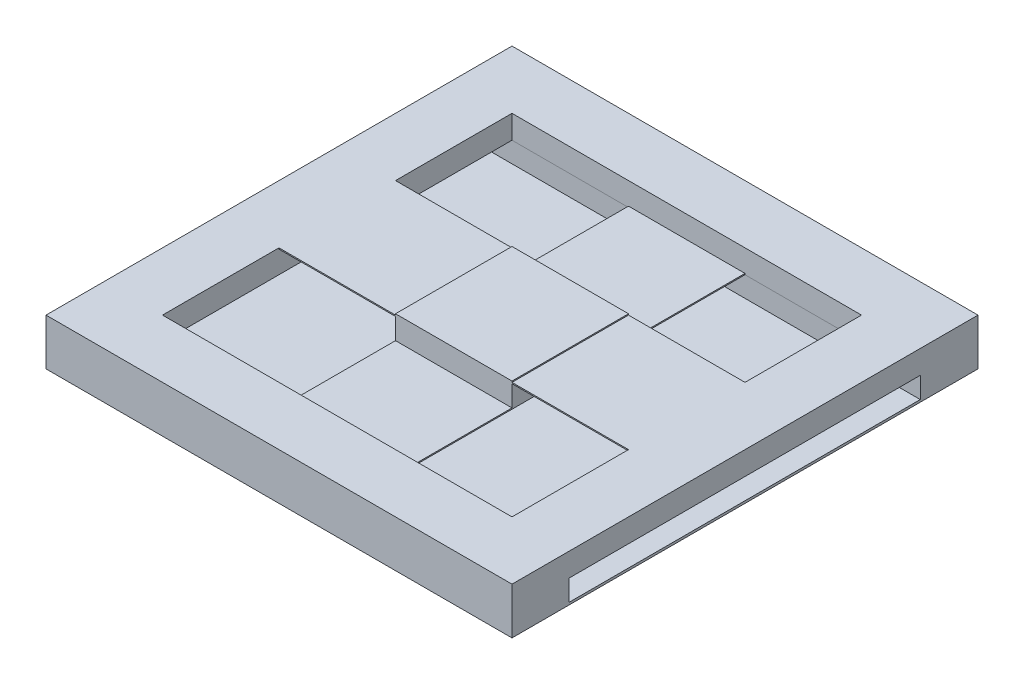
ISO-10303-21;
HEADER;
FILE_DESCRIPTION(('STEP AP214'),'2;1');
FILE_NAME('part.step','',(''),(''),'','','');
FILE_SCHEMA(('AUTOMOTIVE_DESIGN { 1 0 10303 214 1 1 1 1 }'));
ENDSEC;
DATA;
#1=APPLICATION_CONTEXT('core data for automotive mechanical design processes');
#2=APPLICATION_PROTOCOL_DEFINITION('international standard','automotive_design',2000,#1);
#3=PRODUCT_CONTEXT('',#1,'mechanical');
#4=PRODUCT('Part','Part','',(#3));
#5=PRODUCT_RELATED_PRODUCT_CATEGORY('part','',(#4));
#6=PRODUCT_DEFINITION_FORMATION('','',#4);
#7=PRODUCT_DEFINITION_CONTEXT('part definition',#1,'design');
#8=PRODUCT_DEFINITION('design','',#6,#7);
#9=PRODUCT_DEFINITION_SHAPE('','',#8);
#10=(LENGTH_UNIT() NAMED_UNIT(*) SI_UNIT(.MILLI.,.METRE.));
#11=(NAMED_UNIT(*) PLANE_ANGLE_UNIT() SI_UNIT($,.RADIAN.));
#12=(NAMED_UNIT(*) SI_UNIT($,.STERADIAN.) SOLID_ANGLE_UNIT());
#13=UNCERTAINTY_MEASURE_WITH_UNIT(LENGTH_MEASURE(1.E-05),#10,'distance_accuracy_value','');
#14=(GEOMETRIC_REPRESENTATION_CONTEXT(3) GLOBAL_UNCERTAINTY_ASSIGNED_CONTEXT((#13)) GLOBAL_UNIT_ASSIGNED_CONTEXT((#10,
#11,#12)) REPRESENTATION_CONTEXT('',''));
#15=CARTESIAN_POINT('',(0.,0.,0.));
#16=DIRECTION('',(0.,0.,1.));
#17=DIRECTION('',(1.,0.,0.));
#18=AXIS2_PLACEMENT_3D('',#15,#16,#17);
#19=CARTESIAN_POINT('',(2.,-0.2,1.50981101647815));
#20=DIRECTION('',(0.,0.,1.));
#21=DIRECTION('',(1.,0.,0.));
#22=AXIS2_PLACEMENT_3D('',#19,#20,#21);
#23=PLANE('',#22);
#24=DIRECTION('',(1.,0.,0.));
#25=VECTOR('',#24,1.);
#26=CARTESIAN_POINT('',(2.,-0.18,1.50981101647815));
#27=LINE('',#26,#25);
#28=CARTESIAN_POINT('',(-2.,-0.18,1.50981101647815));
#29=VERTEX_POINT('',#28);
#30=CARTESIAN_POINT('',(2.,-0.18,1.50981101647815));
#31=VERTEX_POINT('',#30);
#32=EDGE_CURVE('E271',#29,#31,#27,.T.);
#33=ORIENTED_EDGE('',*,*,#32,.F.);
#34=DIRECTION('',(0.,1.,0.));
#35=VECTOR('',#34,1.);
#36=CARTESIAN_POINT('',(-2.,-0.2,1.50981101647815));
#37=LINE('',#36,#35);
#38=CARTESIAN_POINT('',(-2.,0.,1.50981101647815));
#39=VERTEX_POINT('',#38);
#40=EDGE_CURVE('E91',#29,#39,#37,.T.);
#41=ORIENTED_EDGE('',*,*,#40,.T.);
#42=DIRECTION('',(1.,0.,0.));
#43=VECTOR('',#42,1.);
#44=CARTESIAN_POINT('',(2.,0.,1.50981101647815));
#45=LINE('',#44,#43);
#46=CARTESIAN_POINT('',(2.,0.,1.50981101647815));
#47=VERTEX_POINT('',#46);
#48=EDGE_CURVE('E297',#39,#47,#45,.T.);
#49=ORIENTED_EDGE('',*,*,#48,.T.);
#50=DIRECTION('',(0.,1.,0.));
#51=VECTOR('',#50,1.);
#52=CARTESIAN_POINT('',(2.,-0.2,1.50981101647815));
#53=LINE('',#52,#51);
#54=EDGE_CURVE('E310',#31,#47,#53,.T.);
#55=ORIENTED_EDGE('',*,*,#54,.F.);
#56=EDGE_LOOP('',(#33,#41,#49,#55));
#57=FACE_BOUND('',#56,.T.);
#58=ADVANCED_FACE('F75',(#57),#23,.F.);
#59=CARTESIAN_POINT('',(2.,-0.2,-1.50438518643841));
#60=DIRECTION('',(0.,0.,-1.));
#61=DIRECTION('',(-1.,0.,0.));
#62=AXIS2_PLACEMENT_3D('',#59,#60,#61);
#63=PLANE('',#62);
#64=DIRECTION('',(1.,0.,0.));
#65=VECTOR('',#64,1.);
#66=CARTESIAN_POINT('',(2.,-0.18,-1.50438518643841));
#67=LINE('',#66,#65);
#68=CARTESIAN_POINT('',(-2.,-0.18,-1.50438518643841));
#69=VERTEX_POINT('',#68);
#70=CARTESIAN_POINT('',(2.,-0.18,-1.50438518643841));
#71=VERTEX_POINT('',#70);
#72=EDGE_CURVE('E275',#69,#71,#67,.T.);
#73=ORIENTED_EDGE('',*,*,#72,.T.);
#74=DIRECTION('',(0.,1.,0.));
#75=VECTOR('',#74,1.);
#76=CARTESIAN_POINT('',(2.,-0.2,-1.50438518643841));
#77=LINE('',#76,#75);
#78=CARTESIAN_POINT('',(2.,0.,-1.50438518643841));
#79=VERTEX_POINT('',#78);
#80=EDGE_CURVE('E280',#71,#79,#77,.T.);
#81=ORIENTED_EDGE('',*,*,#80,.T.);
#82=DIRECTION('',(-1.,0.,0.));
#83=VECTOR('',#82,1.);
#84=CARTESIAN_POINT('',(2.,0.,-1.50438518643841));
#85=LINE('',#84,#83);
#86=CARTESIAN_POINT('',(-2.,0.,-1.50438518643841));
#87=VERTEX_POINT('',#86);
#88=EDGE_CURVE('E284',#79,#87,#85,.T.);
#89=ORIENTED_EDGE('',*,*,#88,.T.);
#90=DIRECTION('',(0.,1.,0.));
#91=VECTOR('',#90,1.);
#92=CARTESIAN_POINT('',(-2.,-0.2,-1.50438518643841));
#93=LINE('',#92,#91);
#94=EDGE_CURVE('E266',#69,#87,#93,.T.);
#95=ORIENTED_EDGE('',*,*,#94,.F.);
#96=EDGE_LOOP('',(#73,#81,#89,#95));
#97=FACE_BOUND('',#96,.T.);
#98=ADVANCED_FACE('F282',(#97),#63,.F.);
#99=CARTESIAN_POINT('',(0.,0.,0.));
#100=DIRECTION('',(0.,-1.,0.));
#101=DIRECTION('',(0.,0.,-1.));
#102=AXIS2_PLACEMENT_3D('',#99,#100,#101);
#103=PLANE('',#102);
#104=DIRECTION('',(0.,0.,-1.));
#105=VECTOR('',#104,1.);
#106=CARTESIAN_POINT('',(0.5,0.,0.5));
#107=LINE('',#106,#105);
#108=CARTESIAN_POINT('',(0.5,0.,1.5));
#109=VERTEX_POINT('',#108);
#110=CARTESIAN_POINT('',(0.5,0.,-1.5));
#111=VERTEX_POINT('',#110);
#112=EDGE_CURVE('E523',#109,#111,#107,.T.);
#113=ORIENTED_EDGE('',*,*,#112,.F.);
#114=DIRECTION('',(1.,0.,0.));
#115=VECTOR('',#114,1.);
#116=CARTESIAN_POINT('',(-1.5,0.,1.5));
#117=LINE('',#116,#115);
#118=CARTESIAN_POINT('',(1.5,0.,1.5));
#119=VERTEX_POINT('',#118);
#120=EDGE_CURVE('E468',#109,#119,#117,.T.);
#121=ORIENTED_EDGE('',*,*,#120,.T.);
#122=DIRECTION('',(0.,0.,-1.));
#123=VECTOR('',#122,1.);
#124=CARTESIAN_POINT('',(1.5,0.,1.5));
#125=LINE('',#124,#123);
#126=CARTESIAN_POINT('',(1.5,0.,-1.5));
#127=VERTEX_POINT('',#126);
#128=EDGE_CURVE('E467',#119,#127,#125,.T.);
#129=ORIENTED_EDGE('',*,*,#128,.T.);
#130=DIRECTION('',(1.,0.,0.));
#131=VECTOR('',#130,1.);
#132=CARTESIAN_POINT('',(-1.5,0.,-1.5));
#133=LINE('',#132,#131);
#134=EDGE_CURVE('E477',#111,#127,#133,.T.);
#135=ORIENTED_EDGE('',*,*,#134,.F.);
#136=EDGE_LOOP('',(#113,#121,#129,#135));
#137=FACE_BOUND('',#136,.T.);
#138=CARTESIAN_POINT('',(-1.5,0.,1.5));
#139=VERTEX_POINT('',#138);
#140=CARTESIAN_POINT('',(-0.5,0.,1.5));
#141=VERTEX_POINT('',#140);
#142=EDGE_CURVE('E463',#139,#141,#117,.T.);
#143=ORIENTED_EDGE('',*,*,#142,.T.);
#144=DIRECTION('',(0.,0.,1.));
#145=VECTOR('',#144,1.);
#146=CARTESIAN_POINT('',(-0.5,0.,0.5));
#147=LINE('',#146,#145);
#148=CARTESIAN_POINT('',(-0.5,0.,-1.5));
#149=VERTEX_POINT('',#148);
#150=EDGE_CURVE('E538',#149,#141,#147,.T.);
#151=ORIENTED_EDGE('',*,*,#150,.F.);
#152=CARTESIAN_POINT('',(-1.5,0.,-1.5));
#153=VERTEX_POINT('',#152);
#154=EDGE_CURVE('E472',#153,#149,#133,.T.);
#155=ORIENTED_EDGE('',*,*,#154,.F.);
#156=DIRECTION('',(0.,0.,-1.));
#157=VECTOR('',#156,1.);
#158=CARTESIAN_POINT('',(-1.5,0.,1.5));
#159=LINE('',#158,#157);
#160=EDGE_CURVE('E457',#139,#153,#159,.T.);
#161=ORIENTED_EDGE('',*,*,#160,.F.);
#162=EDGE_LOOP('',(#143,#151,#155,#161));
#163=FACE_BOUND('',#162,.T.);
#164=DIRECTION('',(0.,0.,-1.));
#165=VECTOR('',#164,1.);
#166=CARTESIAN_POINT('',(-2.,0.,2.));
#167=LINE('',#166,#165);
#168=EDGE_CURVE('E434',#39,#87,#167,.T.);
#169=ORIENTED_EDGE('',*,*,#168,.T.);
#170=ORIENTED_EDGE('',*,*,#88,.F.);
#171=DIRECTION('',(0.,0.,-1.));
#172=VECTOR('',#171,1.);
#173=CARTESIAN_POINT('',(2.,0.,2.));
#174=LINE('',#173,#172);
#175=EDGE_CURVE('E429',#47,#79,#174,.T.);
#176=ORIENTED_EDGE('',*,*,#175,.F.);
#177=ORIENTED_EDGE('',*,*,#48,.F.);
#178=EDGE_LOOP('',(#169,#170,#176,#177));
#179=FACE_BOUND('',#178,.T.);
#180=ADVANCED_FACE('F578',(#137,#163,#179),#103,.T.);
#181=CARTESIAN_POINT('',(0.,0.2,0.));
#182=DIRECTION('',(0.,-1.,0.));
#183=DIRECTION('',(0.,0.,-1.));
#184=AXIS2_PLACEMENT_3D('',#181,#182,#183);
#185=PLANE('',#184);
#186=DIRECTION('',(1.,0.,0.));
#187=VECTOR('',#186,1.);
#188=CARTESIAN_POINT('',(-2.,0.2,2.));
#189=LINE('',#188,#187);
#190=CARTESIAN_POINT('',(-2.,0.2,2.));
#191=VERTEX_POINT('',#190);
#192=CARTESIAN_POINT('',(2.,0.2,2.));
#193=VERTEX_POINT('',#192);
#194=EDGE_CURVE('E435',#191,#193,#189,.T.);
#195=ORIENTED_EDGE('',*,*,#194,.T.);
#196=DIRECTION('',(0.,0.,-1.));
#197=VECTOR('',#196,1.);
#198=CARTESIAN_POINT('',(2.,0.2,2.));
#199=LINE('',#198,#197);
#200=CARTESIAN_POINT('',(2.,0.2,-2.));
#201=VERTEX_POINT('',#200);
#202=EDGE_CURVE('E430',#193,#201,#199,.T.);
#203=ORIENTED_EDGE('',*,*,#202,.T.);
#204=DIRECTION('',(1.,0.,0.));
#205=VECTOR('',#204,1.);
#206=CARTESIAN_POINT('',(-2.,0.2,-2.));
#207=LINE('',#206,#205);
#208=CARTESIAN_POINT('',(-2.,0.2,-2.));
#209=VERTEX_POINT('',#208);
#210=EDGE_CURVE('E425',#209,#201,#207,.T.);
#211=ORIENTED_EDGE('',*,*,#210,.F.);
#212=DIRECTION('',(0.,0.,-1.));
#213=VECTOR('',#212,1.);
#214=CARTESIAN_POINT('',(-2.,0.2,2.));
#215=LINE('',#214,#213);
#216=EDGE_CURVE('E419',#191,#209,#215,.T.);
#217=ORIENTED_EDGE('',*,*,#216,.F.);
#218=EDGE_LOOP('',(#195,#203,#211,#217));
#219=FACE_BOUND('',#218,.T.);
#220=DIRECTION('',(0.,0.,-1.));
#221=VECTOR('',#220,1.);
#222=CARTESIAN_POINT('',(0.5,0.2,0.5));
#223=LINE('',#222,#221);
#224=CARTESIAN_POINT('',(0.5,0.2,0.5));
#225=VERTEX_POINT('',#224);
#226=CARTESIAN_POINT('',(0.5,0.2,-0.5));
#227=VERTEX_POINT('',#226);
#228=EDGE_CURVE('E317',#225,#227,#223,.T.);
#229=ORIENTED_EDGE('',*,*,#228,.F.);
#230=DIRECTION('',(1.,0.,0.));
#231=VECTOR('',#230,1.);
#232=CARTESIAN_POINT('',(-0.5,0.2,0.5));
#233=LINE('',#232,#231);
#234=CARTESIAN_POINT('',(1.5,0.2,0.5));
#235=VERTEX_POINT('',#234);
#236=EDGE_CURVE('E530',#225,#235,#233,.T.);
#237=ORIENTED_EDGE('',*,*,#236,.T.);
#238=DIRECTION('',(0.,0.,-1.));
#239=VECTOR('',#238,1.);
#240=CARTESIAN_POINT('',(1.5,0.2,1.5));
#241=LINE('',#240,#239);
#242=CARTESIAN_POINT('',(1.5,0.2,1.5));
#243=VERTEX_POINT('',#242);
#244=EDGE_CURVE('E448',#243,#235,#241,.T.);
#245=ORIENTED_EDGE('',*,*,#244,.F.);
#246=DIRECTION('',(1.,0.,0.));
#247=VECTOR('',#246,1.);
#248=CARTESIAN_POINT('',(-1.5,0.2,1.5));
#249=LINE('',#248,#247);
#250=CARTESIAN_POINT('',(-1.5,0.2,1.5));
#251=VERTEX_POINT('',#250);
#252=EDGE_CURVE('E453',#251,#243,#249,.T.);
#253=ORIENTED_EDGE('',*,*,#252,.F.);
#254=DIRECTION('',(0.,0.,-1.));
#255=VECTOR('',#254,1.);
#256=CARTESIAN_POINT('',(-1.5,0.2,1.5));
#257=LINE('',#256,#255);
#258=CARTESIAN_POINT('',(-1.5,0.2,0.5));
#259=VERTEX_POINT('',#258);
#260=EDGE_CURVE('E440',#251,#259,#257,.T.);
#261=ORIENTED_EDGE('',*,*,#260,.T.);
#262=CARTESIAN_POINT('',(-0.5,0.2,0.5));
#263=VERTEX_POINT('',#262);
#264=EDGE_CURVE('E532',#259,#263,#233,.T.);
#265=ORIENTED_EDGE('',*,*,#264,.T.);
#266=DIRECTION('',(0.,0.,1.));
#267=VECTOR('',#266,1.);
#268=CARTESIAN_POINT('',(-0.5,0.2,0.5));
#269=LINE('',#268,#267);
#270=CARTESIAN_POINT('',(-0.5,0.2,-0.5));
#271=VERTEX_POINT('',#270);
#272=EDGE_CURVE('E99',#271,#263,#269,.T.);
#273=ORIENTED_EDGE('',*,*,#272,.F.);
#274=DIRECTION('',(-1.,0.,0.));
#275=VECTOR('',#274,1.);
#276=CARTESIAN_POINT('',(-0.5,0.2,-0.5));
#277=LINE('',#276,#275);
#278=CARTESIAN_POINT('',(-1.5,0.2,-0.5));
#279=VERTEX_POINT('',#278);
#280=EDGE_CURVE('E531',#271,#279,#277,.T.);
#281=ORIENTED_EDGE('',*,*,#280,.T.);
#282=CARTESIAN_POINT('',(-1.5,0.2,-1.5));
#283=VERTEX_POINT('',#282);
#284=EDGE_CURVE('E444',#279,#283,#257,.T.);
#285=ORIENTED_EDGE('',*,*,#284,.T.);
#286=DIRECTION('',(1.,0.,0.));
#287=VECTOR('',#286,1.);
#288=CARTESIAN_POINT('',(-1.5,0.2,-1.5));
#289=LINE('',#288,#287);
#290=CARTESIAN_POINT('',(1.5,0.2,-1.5));
#291=VERTEX_POINT('',#290);
#292=EDGE_CURVE('E439',#283,#291,#289,.T.);
#293=ORIENTED_EDGE('',*,*,#292,.T.);
#294=CARTESIAN_POINT('',(1.5,0.2,-0.5));
#295=VERTEX_POINT('',#294);
#296=EDGE_CURVE('E452',#295,#291,#241,.T.);
#297=ORIENTED_EDGE('',*,*,#296,.F.);
#298=EDGE_CURVE('E527',#295,#227,#277,.T.);
#299=ORIENTED_EDGE('',*,*,#298,.T.);
#300=EDGE_LOOP('',(#229,#237,#245,#253,#261,#265,#273,#281,#285,#293,#297,#299));
#301=FACE_BOUND('',#300,.T.);
#302=ADVANCED_FACE('F588',(#219,#301),#185,.F.);
#303=CARTESIAN_POINT('',(-0.5,0.2,0.5));
#304=DIRECTION('',(1.,0.,0.));
#305=DIRECTION('',(0.,0.,-1.));
#306=AXIS2_PLACEMENT_3D('',#303,#304,#305);
#307=PLANE('',#306);
#308=DIRECTION('',(0.,0.,1.));
#309=VECTOR('',#308,1.);
#310=CARTESIAN_POINT('',(-0.5,0.19,-0.5));
#311=LINE('',#310,#309);
#312=CARTESIAN_POINT('',(-0.5,0.19,-0.5));
#313=VERTEX_POINT('',#312);
#314=CARTESIAN_POINT('',(-0.5,0.19,0.5));
#315=VERTEX_POINT('',#314);
#316=EDGE_CURVE('E352',#313,#315,#311,.T.);
#317=ORIENTED_EDGE('',*,*,#316,.F.);
#318=DIRECTION('',(0.,-1.,0.));
#319=VECTOR('',#318,1.);
#320=CARTESIAN_POINT('',(-0.5,0.2,-0.5));
#321=LINE('',#320,#319);
#322=CARTESIAN_POINT('',(-0.5,0.01,-0.5));
#323=VERTEX_POINT('',#322);
#324=EDGE_CURVE('E84',#313,#323,#321,.T.);
#325=ORIENTED_EDGE('',*,*,#324,.T.);
#326=DIRECTION('',(0.,0.,-1.));
#327=VECTOR('',#326,1.);
#328=CARTESIAN_POINT('',(-0.5,0.01,-0.5));
#329=LINE('',#328,#327);
#330=CARTESIAN_POINT('',(-0.5,0.01,-1.5));
#331=VERTEX_POINT('',#330);
#332=EDGE_CURVE('E483',#323,#331,#329,.T.);
#333=ORIENTED_EDGE('',*,*,#332,.T.);
#334=DIRECTION('',(0.,-1.,0.));
#335=VECTOR('',#334,1.);
#336=CARTESIAN_POINT('',(-0.5,0.01,-1.5));
#337=LINE('',#336,#335);
#338=EDGE_CURVE('E518',#331,#149,#337,.T.);
#339=ORIENTED_EDGE('',*,*,#338,.T.);
#340=ORIENTED_EDGE('',*,*,#150,.T.);
#341=DIRECTION('',(0.,-1.,0.));
#342=VECTOR('',#341,1.);
#343=CARTESIAN_POINT('',(-0.5,0.01,1.5));
#344=LINE('',#343,#342);
#345=CARTESIAN_POINT('',(-0.5,0.01,1.5));
#346=VERTEX_POINT('',#345);
#347=EDGE_CURVE('E411',#346,#141,#344,.T.);
#348=ORIENTED_EDGE('',*,*,#347,.F.);
#349=DIRECTION('',(0.,0.,1.));
#350=VECTOR('',#349,1.);
#351=CARTESIAN_POINT('',(-0.5,0.01,0.5));
#352=LINE('',#351,#350);
#353=CARTESIAN_POINT('',(-0.5,0.01,0.5));
#354=VERTEX_POINT('',#353);
#355=EDGE_CURVE('E393',#354,#346,#352,.T.);
#356=ORIENTED_EDGE('',*,*,#355,.F.);
#357=DIRECTION('',(0.,-1.,0.));
#358=VECTOR('',#357,1.);
#359=CARTESIAN_POINT('',(-0.5,0.2,0.5));
#360=LINE('',#359,#358);
#361=EDGE_CURVE('E543',#315,#354,#360,.T.);
#362=ORIENTED_EDGE('',*,*,#361,.F.);
#363=EDGE_LOOP('',(#317,#325,#333,#339,#340,#348,#356,#362));
#364=FACE_BOUND('',#363,.T.);
#365=ADVANCED_FACE('F550',(#364),#307,.F.);
#366=CARTESIAN_POINT('',(-1.5,-5.65685424949238,1.5));
#367=DIRECTION('',(1.,0.,0.));
#368=DIRECTION('',(0.,0.,-1.));
#369=AXIS2_PLACEMENT_3D('',#366,#367,#368);
#370=PLANE('',#369);
#371=DIRECTION('',(0.,0.,-1.));
#372=VECTOR('',#371,1.);
#373=CARTESIAN_POINT('',(-1.5,0.19,-0.5));
#374=LINE('',#373,#372);
#375=CARTESIAN_POINT('',(-1.5,0.19,0.5));
#376=VERTEX_POINT('',#375);
#377=CARTESIAN_POINT('',(-1.5,0.19,-0.5));
#378=VERTEX_POINT('',#377);
#379=EDGE_CURVE('E359',#376,#378,#374,.T.);
#380=ORIENTED_EDGE('',*,*,#379,.F.);
#381=DIRECTION('',(0.,1.,0.));
#382=VECTOR('',#381,1.);
#383=CARTESIAN_POINT('',(-1.5,0.19,0.5));
#384=LINE('',#383,#382);
#385=EDGE_CURVE('E366',#376,#259,#384,.T.);
#386=ORIENTED_EDGE('',*,*,#385,.T.);
#387=ORIENTED_EDGE('',*,*,#260,.F.);
#388=DIRECTION('',(0.,1.,0.));
#389=VECTOR('',#388,1.);
#390=CARTESIAN_POINT('',(-1.5,-5.65685424949238,1.5));
#391=LINE('',#390,#389);
#392=EDGE_CURVE('E458',#139,#251,#391,.T.);
#393=ORIENTED_EDGE('',*,*,#392,.F.);
#394=ORIENTED_EDGE('',*,*,#160,.T.);
#395=DIRECTION('',(0.,1.,0.));
#396=VECTOR('',#395,1.);
#397=CARTESIAN_POINT('',(-1.5,-5.65685424949238,-1.5));
#398=LINE('',#397,#396);
#399=EDGE_CURVE('E471',#153,#283,#398,.T.);
#400=ORIENTED_EDGE('',*,*,#399,.T.);
#401=ORIENTED_EDGE('',*,*,#284,.F.);
#402=DIRECTION('',(0.,1.,0.));
#403=VECTOR('',#402,1.);
#404=CARTESIAN_POINT('',(-1.5,0.19,-0.5));
#405=LINE('',#404,#403);
#406=EDGE_CURVE('E365',#378,#279,#405,.T.);
#407=ORIENTED_EDGE('',*,*,#406,.F.);
#408=EDGE_LOOP('',(#380,#386,#387,#393,#394,#400,#401,#407));
#409=FACE_BOUND('',#408,.T.);
#410=ADVANCED_FACE('F582',(#409),#370,.T.);
#411=CARTESIAN_POINT('',(0.5,0.2,0.5));
#412=DIRECTION('',(-1.,0.,0.));
#413=DIRECTION('',(0.,0.,1.));
#414=AXIS2_PLACEMENT_3D('',#411,#412,#413);
#415=PLANE('',#414);
#416=DIRECTION('',(0.,0.,1.));
#417=VECTOR('',#416,1.);
#418=CARTESIAN_POINT('',(0.5,0.19,-0.5));
#419=LINE('',#418,#417);
#420=CARTESIAN_POINT('',(0.5,0.19,-0.5));
#421=VERTEX_POINT('',#420);
#422=CARTESIAN_POINT('',(0.5,0.19,0.5));
#423=VERTEX_POINT('',#422);
#424=EDGE_CURVE('E370',#421,#423,#419,.T.);
#425=ORIENTED_EDGE('',*,*,#424,.T.);
#426=DIRECTION('',(0.,-1.,0.));
#427=VECTOR('',#426,1.);
#428=CARTESIAN_POINT('',(0.5,0.2,0.5));
#429=LINE('',#428,#427);
#430=CARTESIAN_POINT('',(0.5,0.01,0.5));
#431=VERTEX_POINT('',#430);
#432=EDGE_CURVE('E535',#423,#431,#429,.T.);
#433=ORIENTED_EDGE('',*,*,#432,.T.);
#434=DIRECTION('',(0.,0.,-1.));
#435=VECTOR('',#434,1.);
#436=CARTESIAN_POINT('',(0.5,0.01,0.5));
#437=LINE('',#436,#435);
#438=CARTESIAN_POINT('',(0.5,0.01,1.5));
#439=VERTEX_POINT('',#438);
#440=EDGE_CURVE('E403',#439,#431,#437,.T.);
#441=ORIENTED_EDGE('',*,*,#440,.F.);
#442=DIRECTION('',(0.,-1.,0.));
#443=VECTOR('',#442,1.);
#444=CARTESIAN_POINT('',(0.5,0.01,1.5));
#445=LINE('',#444,#443);
#446=EDGE_CURVE('E410',#439,#109,#445,.T.);
#447=ORIENTED_EDGE('',*,*,#446,.T.);
#448=ORIENTED_EDGE('',*,*,#112,.T.);
#449=DIRECTION('',(0.,-1.,0.));
#450=VECTOR('',#449,1.);
#451=CARTESIAN_POINT('',(0.5,0.01,-1.5));
#452=LINE('',#451,#450);
#453=CARTESIAN_POINT('',(0.5,0.01,-1.5));
#454=VERTEX_POINT('',#453);
#455=EDGE_CURVE('E519',#454,#111,#452,.T.);
#456=ORIENTED_EDGE('',*,*,#455,.F.);
#457=DIRECTION('',(0.,0.,1.));
#458=VECTOR('',#457,1.);
#459=CARTESIAN_POINT('',(0.5,0.01,-0.5));
#460=LINE('',#459,#458);
#461=CARTESIAN_POINT('',(0.5,0.01,-0.5));
#462=VERTEX_POINT('',#461);
#463=EDGE_CURVE('E510',#454,#462,#460,.T.);
#464=ORIENTED_EDGE('',*,*,#463,.T.);
#465=DIRECTION('',(0.,-1.,0.));
#466=VECTOR('',#465,1.);
#467=CARTESIAN_POINT('',(0.5,0.2,-0.5));
#468=LINE('',#467,#466);
#469=EDGE_CURVE('E12',#421,#462,#468,.T.);
#470=ORIENTED_EDGE('',*,*,#469,.F.);
#471=EDGE_LOOP('',(#425,#433,#441,#447,#448,#456,#464,#470));
#472=FACE_BOUND('',#471,.T.);
#473=ADVANCED_FACE('F77',(#472),#415,.F.);
#474=CARTESIAN_POINT('',(-0.5,0.2,0.5));
#475=DIRECTION('',(0.,0.,-1.));
#476=DIRECTION('',(-1.,0.,0.));
#477=AXIS2_PLACEMENT_3D('',#474,#475,#476);
#478=PLANE('',#477);
#479=DIRECTION('',(-1.,0.,0.));
#480=VECTOR('',#479,1.);
#481=CARTESIAN_POINT('',(-0.5,0.01,0.5));
#482=LINE('',#481,#480);
#483=EDGE_CURVE('E399',#431,#354,#482,.T.);
#484=ORIENTED_EDGE('',*,*,#483,.F.);
#485=ORIENTED_EDGE('',*,*,#432,.F.);
#486=DIRECTION('',(1.,0.,0.));
#487=VECTOR('',#486,1.);
#488=CARTESIAN_POINT('',(0.5,0.19,0.5));
#489=LINE('',#488,#487);
#490=CARTESIAN_POINT('',(1.5,0.19,0.5));
#491=VERTEX_POINT('',#490);
#492=EDGE_CURVE('E377',#423,#491,#489,.T.);
#493=ORIENTED_EDGE('',*,*,#492,.T.);
#494=DIRECTION('',(0.,1.,0.));
#495=VECTOR('',#494,1.);
#496=CARTESIAN_POINT('',(1.5,0.19,0.5));
#497=LINE('',#496,#495);
#498=EDGE_CURVE('E388',#491,#235,#497,.T.);
#499=ORIENTED_EDGE('',*,*,#498,.T.);
#500=ORIENTED_EDGE('',*,*,#236,.F.);
#501=DIRECTION('',(0.,-1.,0.));
#502=VECTOR('',#501,1.);
#503=CARTESIAN_POINT('',(0.5,0.21,0.5));
#504=LINE('',#503,#502);
#505=CARTESIAN_POINT('',(0.5,0.21,0.5));
#506=VERTEX_POINT('',#505);
#507=EDGE_CURVE('E331',#506,#225,#504,.T.);
#508=ORIENTED_EDGE('',*,*,#507,.F.);
#509=DIRECTION('',(1.,0.,0.));
#510=VECTOR('',#509,1.);
#511=CARTESIAN_POINT('',(-0.5,0.21,0.5));
#512=LINE('',#511,#510);
#513=CARTESIAN_POINT('',(-0.5,0.21,0.5));
#514=VERTEX_POINT('',#513);
#515=EDGE_CURVE('E328',#514,#506,#512,.T.);
#516=ORIENTED_EDGE('',*,*,#515,.F.);
#517=DIRECTION('',(0.,-1.,0.));
#518=VECTOR('',#517,1.);
#519=CARTESIAN_POINT('',(-0.5,0.21,0.5));
#520=LINE('',#519,#518);
#521=EDGE_CURVE('E340',#514,#263,#520,.T.);
#522=ORIENTED_EDGE('',*,*,#521,.T.);
#523=ORIENTED_EDGE('',*,*,#264,.F.);
#524=ORIENTED_EDGE('',*,*,#385,.F.);
#525=DIRECTION('',(-1.,0.,0.));
#526=VECTOR('',#525,1.);
#527=CARTESIAN_POINT('',(-0.5,0.19,0.5));
#528=LINE('',#527,#526);
#529=EDGE_CURVE('E362',#315,#376,#528,.T.);
#530=ORIENTED_EDGE('',*,*,#529,.F.);
#531=ORIENTED_EDGE('',*,*,#361,.T.);
#532=EDGE_LOOP('',(#484,#485,#493,#499,#500,#508,#516,#522,#523,#524,#530,#531));
#533=FACE_BOUND('',#532,.T.);
#534=ADVANCED_FACE('F606',(#533),#478,.F.);
#535=CARTESIAN_POINT('',(-1.5,-5.65685424949238,1.5));
#536=DIRECTION('',(0.,0.,1.));
#537=DIRECTION('',(1.,0.,0.));
#538=AXIS2_PLACEMENT_3D('',#535,#536,#537);
#539=PLANE('',#538);
#540=ORIENTED_EDGE('',*,*,#347,.T.);
#541=ORIENTED_EDGE('',*,*,#142,.F.);
#542=ORIENTED_EDGE('',*,*,#392,.T.);
#543=ORIENTED_EDGE('',*,*,#252,.T.);
#544=DIRECTION('',(0.,1.,0.));
#545=VECTOR('',#544,1.);
#546=CARTESIAN_POINT('',(1.5,-5.65685424949238,1.5));
#547=LINE('',#546,#545);
#548=EDGE_CURVE('E500',#119,#243,#547,.T.);
#549=ORIENTED_EDGE('',*,*,#548,.F.);
#550=ORIENTED_EDGE('',*,*,#120,.F.);
#551=ORIENTED_EDGE('',*,*,#446,.F.);
#552=DIRECTION('',(1.,0.,0.));
#553=VECTOR('',#552,1.);
#554=CARTESIAN_POINT('',(-0.5,0.01,1.5));
#555=LINE('',#554,#553);
#556=EDGE_CURVE('E407',#346,#439,#555,.T.);
#557=ORIENTED_EDGE('',*,*,#556,.F.);
#558=EDGE_LOOP('',(#540,#541,#542,#543,#549,#550,#551,#557));
#559=FACE_BOUND('',#558,.T.);
#560=ADVANCED_FACE('F574',(#559),#539,.F.);
#561=CARTESIAN_POINT('',(-0.5,0.2,-0.5));
#562=DIRECTION('',(0.,0.,1.));
#563=DIRECTION('',(1.,0.,0.));
#564=AXIS2_PLACEMENT_3D('',#561,#562,#563);
#565=PLANE('',#564);
#566=ORIENTED_EDGE('',*,*,#298,.F.);
#567=DIRECTION('',(0.,1.,0.));
#568=VECTOR('',#567,1.);
#569=CARTESIAN_POINT('',(1.5,0.19,-0.5));
#570=LINE('',#569,#568);
#571=CARTESIAN_POINT('',(1.5,0.19,-0.5));
#572=VERTEX_POINT('',#571);
#573=EDGE_CURVE('E389',#572,#295,#570,.T.);
#574=ORIENTED_EDGE('',*,*,#573,.F.);
#575=DIRECTION('',(-1.,0.,0.));
#576=VECTOR('',#575,1.);
#577=CARTESIAN_POINT('',(0.5,0.19,-0.5));
#578=LINE('',#577,#576);
#579=EDGE_CURVE('E384',#572,#421,#578,.T.);
#580=ORIENTED_EDGE('',*,*,#579,.T.);
#581=ORIENTED_EDGE('',*,*,#469,.T.);
#582=DIRECTION('',(-1.,0.,0.));
#583=VECTOR('',#582,1.);
#584=CARTESIAN_POINT('',(-0.5,0.01,-0.5));
#585=LINE('',#584,#583);
#586=EDGE_CURVE('E514',#462,#323,#585,.T.);
#587=ORIENTED_EDGE('',*,*,#586,.T.);
#588=ORIENTED_EDGE('',*,*,#324,.F.);
#589=DIRECTION('',(1.,0.,0.));
#590=VECTOR('',#589,1.);
#591=CARTESIAN_POINT('',(-0.5,0.19,-0.5));
#592=LINE('',#591,#590);
#593=EDGE_CURVE('E356',#378,#313,#592,.T.);
#594=ORIENTED_EDGE('',*,*,#593,.F.);
#595=ORIENTED_EDGE('',*,*,#406,.T.);
#596=ORIENTED_EDGE('',*,*,#280,.F.);
#597=DIRECTION('',(0.,-1.,0.));
#598=VECTOR('',#597,1.);
#599=CARTESIAN_POINT('',(-0.5,0.21,-0.5));
#600=LINE('',#599,#598);
#601=CARTESIAN_POINT('',(-0.5,0.21,-0.5));
#602=VERTEX_POINT('',#601);
#603=EDGE_CURVE('E344',#602,#271,#600,.T.);
#604=ORIENTED_EDGE('',*,*,#603,.F.);
#605=DIRECTION('',(-1.,0.,0.));
#606=VECTOR('',#605,1.);
#607=CARTESIAN_POINT('',(-0.5,0.21,-0.5));
#608=LINE('',#607,#606);
#609=CARTESIAN_POINT('',(0.5,0.21,-0.5));
#610=VERTEX_POINT('',#609);
#611=EDGE_CURVE('E322',#610,#602,#608,.T.);
#612=ORIENTED_EDGE('',*,*,#611,.F.);
#613=DIRECTION('',(0.,-1.,0.));
#614=VECTOR('',#613,1.);
#615=CARTESIAN_POINT('',(0.5,0.21,-0.5));
#616=LINE('',#615,#614);
#617=EDGE_CURVE('E348',#610,#227,#616,.T.);
#618=ORIENTED_EDGE('',*,*,#617,.T.);
#619=EDGE_LOOP('',(#566,#574,#580,#581,#587,#588,#594,#595,#596,#604,#612,#618));
#620=FACE_BOUND('',#619,.T.);
#621=ADVANCED_FACE('F558',(#620),#565,.F.);
#622=CARTESIAN_POINT('',(0.,0.01,0.));
#623=DIRECTION('',(0.,-1.,0.));
#624=DIRECTION('',(0.,0.,-1.));
#625=AXIS2_PLACEMENT_3D('',#622,#623,#624);
#626=PLANE('',#625);
#627=ORIENTED_EDGE('',*,*,#332,.F.);
#628=ORIENTED_EDGE('',*,*,#586,.F.);
#629=ORIENTED_EDGE('',*,*,#463,.F.);
#630=DIRECTION('',(1.,0.,0.));
#631=VECTOR('',#630,1.);
#632=CARTESIAN_POINT('',(-0.5,0.01,-1.5));
#633=LINE('',#632,#631);
#634=EDGE_CURVE('E506',#331,#454,#633,.T.);
#635=ORIENTED_EDGE('',*,*,#634,.F.);
#636=EDGE_LOOP('',(#627,#628,#629,#635));
#637=FACE_BOUND('',#636,.T.);
#638=ADVANCED_FACE('F557',(#637),#626,.F.);
#639=CARTESIAN_POINT('',(-1.5,-5.65685424949238,-1.5));
#640=DIRECTION('',(0.,0.,1.));
#641=DIRECTION('',(1.,0.,0.));
#642=AXIS2_PLACEMENT_3D('',#639,#640,#641);
#643=PLANE('',#642);
#644=ORIENTED_EDGE('',*,*,#455,.T.);
#645=ORIENTED_EDGE('',*,*,#134,.T.);
#646=DIRECTION('',(0.,1.,0.));
#647=VECTOR('',#646,1.);
#648=CARTESIAN_POINT('',(1.5,-5.65685424949238,-1.5));
#649=LINE('',#648,#647);
#650=EDGE_CURVE('E476',#127,#291,#649,.T.);
#651=ORIENTED_EDGE('',*,*,#650,.T.);
#652=ORIENTED_EDGE('',*,*,#292,.F.);
#653=ORIENTED_EDGE('',*,*,#399,.F.);
#654=ORIENTED_EDGE('',*,*,#154,.T.);
#655=ORIENTED_EDGE('',*,*,#338,.F.);
#656=ORIENTED_EDGE('',*,*,#634,.T.);
#657=EDGE_LOOP('',(#644,#645,#651,#652,#653,#654,#655,#656));
#658=FACE_BOUND('',#657,.T.);
#659=ADVANCED_FACE('F566',(#658),#643,.T.);
#660=CARTESIAN_POINT('',(-2.,-5.65685424949238,2.));
#661=DIRECTION('',(0.,0.,1.));
#662=DIRECTION('',(1.,0.,0.));
#663=AXIS2_PLACEMENT_3D('',#660,#661,#662);
#664=PLANE('',#663);
#665=DIRECTION('',(0.,1.,0.));
#666=VECTOR('',#665,1.);
#667=CARTESIAN_POINT('',(-2.,-5.65685424949238,2.));
#668=LINE('',#667,#666);
#669=CARTESIAN_POINT('',(-2.,-0.2,2.));
#670=VERTEX_POINT('',#669);
#671=EDGE_CURVE('E424',#670,#191,#668,.T.);
#672=ORIENTED_EDGE('',*,*,#671,.F.);
#673=DIRECTION('',(-1.,0.,0.));
#674=VECTOR('',#673,1.);
#675=CARTESIAN_POINT('',(2.,-0.2,2.));
#676=LINE('',#675,#674);
#677=CARTESIAN_POINT('',(2.,-0.2,2.));
#678=VERTEX_POINT('',#677);
#679=EDGE_CURVE('E303',#678,#670,#676,.T.);
#680=ORIENTED_EDGE('',*,*,#679,.F.);
#681=DIRECTION('',(0.,1.,0.));
#682=VECTOR('',#681,1.);
#683=CARTESIAN_POINT('',(2.,-5.65685424949238,2.));
#684=LINE('',#683,#682);
#685=EDGE_CURVE('E415',#678,#193,#684,.T.);
#686=ORIENTED_EDGE('',*,*,#685,.T.);
#687=ORIENTED_EDGE('',*,*,#194,.F.);
#688=EDGE_LOOP('',(#672,#680,#686,#687));
#689=FACE_BOUND('',#688,.T.);
#690=ADVANCED_FACE('F723',(#689),#664,.T.);
#691=CARTESIAN_POINT('',(-2.,-5.65685424949238,2.));
#692=DIRECTION('',(1.,0.,0.));
#693=DIRECTION('',(0.,0.,-1.));
#694=AXIS2_PLACEMENT_3D('',#691,#692,#693);
#695=PLANE('',#694);
#696=ORIENTED_EDGE('',*,*,#40,.F.);
#697=DIRECTION('',(0.,0.,1.));
#698=VECTOR('',#697,1.);
#699=CARTESIAN_POINT('',(-2.,-0.18,-5.50443518612591));
#700=LINE('',#699,#698);
#701=EDGE_CURVE('E260',#69,#29,#700,.T.);
#702=ORIENTED_EDGE('',*,*,#701,.F.);
#703=ORIENTED_EDGE('',*,*,#94,.T.);
#704=ORIENTED_EDGE('',*,*,#168,.F.);
#705=EDGE_LOOP('',(#696,#702,#703,#704));
#706=FACE_BOUND('',#705,.T.);
#707=DIRECTION('',(0.,1.,0.));
#708=VECTOR('',#707,1.);
#709=CARTESIAN_POINT('',(-2.,-5.65685424949238,-2.));
#710=LINE('',#709,#708);
#711=CARTESIAN_POINT('',(-2.,-0.2,-2.));
#712=VERTEX_POINT('',#711);
#713=EDGE_CURVE('E423',#712,#209,#710,.T.);
#714=ORIENTED_EDGE('',*,*,#713,.F.);
#715=DIRECTION('',(0.,0.,-1.));
#716=VECTOR('',#715,1.);
#717=CARTESIAN_POINT('',(-2.,-0.2,2.));
#718=LINE('',#717,#716);
#719=EDGE_CURVE('E307',#670,#712,#718,.T.);
#720=ORIENTED_EDGE('',*,*,#719,.F.);
#721=ORIENTED_EDGE('',*,*,#671,.T.);
#722=ORIENTED_EDGE('',*,*,#216,.T.);
#723=EDGE_LOOP('',(#714,#720,#721,#722));
#724=FACE_BOUND('',#723,.T.);
#725=ADVANCED_FACE('F262',(#706,#724),#695,.F.);
#726=CARTESIAN_POINT('',(-2.,-5.65685424949238,-2.));
#727=DIRECTION('',(0.,0.,1.));
#728=DIRECTION('',(1.,0.,0.));
#729=AXIS2_PLACEMENT_3D('',#726,#727,#728);
#730=PLANE('',#729);
#731=DIRECTION('',(0.,1.,0.));
#732=VECTOR('',#731,1.);
#733=CARTESIAN_POINT('',(2.,-5.65685424949238,-2.));
#734=LINE('',#733,#732);
#735=CARTESIAN_POINT('',(2.,-0.2,-2.));
#736=VERTEX_POINT('',#735);
#737=EDGE_CURVE('E462',#736,#201,#734,.T.);
#738=ORIENTED_EDGE('',*,*,#737,.F.);
#739=DIRECTION('',(1.,0.,0.));
#740=VECTOR('',#739,1.);
#741=CARTESIAN_POINT('',(2.,-0.2,-2.));
#742=LINE('',#741,#740);
#743=EDGE_CURVE('E287',#712,#736,#742,.T.);
#744=ORIENTED_EDGE('',*,*,#743,.F.);
#745=ORIENTED_EDGE('',*,*,#713,.T.);
#746=ORIENTED_EDGE('',*,*,#210,.T.);
#747=EDGE_LOOP('',(#738,#744,#745,#746));
#748=FACE_BOUND('',#747,.T.);
#749=ADVANCED_FACE('F732',(#748),#730,.F.);
#750=CARTESIAN_POINT('',(2.,-5.65685424949238,2.));
#751=DIRECTION('',(1.,0.,0.));
#752=DIRECTION('',(0.,0.,-1.));
#753=AXIS2_PLACEMENT_3D('',#750,#751,#752);
#754=PLANE('',#753);
#755=DIRECTION('',(0.,0.,1.));
#756=VECTOR('',#755,1.);
#757=CARTESIAN_POINT('',(2.,-0.18,-5.50443518612591));
#758=LINE('',#757,#756);
#759=EDGE_CURVE('E272',#71,#31,#758,.T.);
#760=ORIENTED_EDGE('',*,*,#759,.T.);
#761=ORIENTED_EDGE('',*,*,#54,.T.);
#762=ORIENTED_EDGE('',*,*,#175,.T.);
#763=ORIENTED_EDGE('',*,*,#80,.F.);
#764=EDGE_LOOP('',(#760,#761,#762,#763));
#765=FACE_BOUND('',#764,.T.);
#766=ORIENTED_EDGE('',*,*,#685,.F.);
#767=DIRECTION('',(0.,0.,1.));
#768=VECTOR('',#767,1.);
#769=CARTESIAN_POINT('',(2.,-0.2,2.));
#770=LINE('',#769,#768);
#771=EDGE_CURVE('E299',#736,#678,#770,.T.);
#772=ORIENTED_EDGE('',*,*,#771,.F.);
#773=ORIENTED_EDGE('',*,*,#737,.T.);
#774=ORIENTED_EDGE('',*,*,#202,.F.);
#775=EDGE_LOOP('',(#766,#772,#773,#774));
#776=FACE_BOUND('',#775,.T.);
#777=ADVANCED_FACE('F624',(#765,#776),#754,.T.);
#778=CARTESIAN_POINT('',(1.5,-5.65685424949238,1.5));
#779=DIRECTION('',(1.,0.,0.));
#780=DIRECTION('',(0.,0.,-1.));
#781=AXIS2_PLACEMENT_3D('',#778,#779,#780);
#782=PLANE('',#781);
#783=DIRECTION('',(0.,0.,-1.));
#784=VECTOR('',#783,1.);
#785=CARTESIAN_POINT('',(1.5,0.19,-0.5));
#786=LINE('',#785,#784);
#787=EDGE_CURVE('E381',#491,#572,#786,.T.);
#788=ORIENTED_EDGE('',*,*,#787,.T.);
#789=ORIENTED_EDGE('',*,*,#573,.T.);
#790=ORIENTED_EDGE('',*,*,#296,.T.);
#791=ORIENTED_EDGE('',*,*,#650,.F.);
#792=ORIENTED_EDGE('',*,*,#128,.F.);
#793=ORIENTED_EDGE('',*,*,#548,.T.);
#794=ORIENTED_EDGE('',*,*,#244,.T.);
#795=ORIENTED_EDGE('',*,*,#498,.F.);
#796=EDGE_LOOP('',(#788,#789,#790,#791,#792,#793,#794,#795));
#797=FACE_BOUND('',#796,.T.);
#798=ADVANCED_FACE('F596',(#797),#782,.F.);
#799=CARTESIAN_POINT('',(0.,0.01,0.));
#800=DIRECTION('',(0.,-1.,0.));
#801=DIRECTION('',(0.,0.,1.));
#802=AXIS2_PLACEMENT_3D('',#799,#800,#801);
#803=PLANE('',#802);
#804=ORIENTED_EDGE('',*,*,#355,.T.);
#805=ORIENTED_EDGE('',*,*,#556,.T.);
#806=ORIENTED_EDGE('',*,*,#440,.T.);
#807=ORIENTED_EDGE('',*,*,#483,.T.);
#808=EDGE_LOOP('',(#804,#805,#806,#807));
#809=FACE_BOUND('',#808,.T.);
#810=ADVANCED_FACE('F613',(#809),#803,.F.);
#811=CARTESIAN_POINT('',(0.,0.19,0.));
#812=DIRECTION('',(0.,1.,0.));
#813=DIRECTION('',(0.,0.,1.));
#814=AXIS2_PLACEMENT_3D('',#811,#812,#813);
#815=PLANE('',#814);
#816=ORIENTED_EDGE('',*,*,#424,.F.);
#817=ORIENTED_EDGE('',*,*,#579,.F.);
#818=ORIENTED_EDGE('',*,*,#787,.F.);
#819=ORIENTED_EDGE('',*,*,#492,.F.);
#820=EDGE_LOOP('',(#816,#817,#818,#819));
#821=FACE_BOUND('',#820,.T.);
#822=ADVANCED_FACE('F610',(#821),#815,.F.);
#823=CARTESIAN_POINT('',(0.,0.19,0.));
#824=DIRECTION('',(0.,1.,0.));
#825=DIRECTION('',(0.,0.,1.));
#826=AXIS2_PLACEMENT_3D('',#823,#824,#825);
#827=PLANE('',#826);
#828=ORIENTED_EDGE('',*,*,#316,.T.);
#829=ORIENTED_EDGE('',*,*,#529,.T.);
#830=ORIENTED_EDGE('',*,*,#379,.T.);
#831=ORIENTED_EDGE('',*,*,#593,.T.);
#832=EDGE_LOOP('',(#828,#829,#830,#831));
#833=FACE_BOUND('',#832,.T.);
#834=ADVANCED_FACE('F621',(#833),#827,.F.);
#835=CARTESIAN_POINT('',(0.5,0.21,0.5));
#836=DIRECTION('',(-1.,0.,0.));
#837=DIRECTION('',(0.,0.,1.));
#838=AXIS2_PLACEMENT_3D('',#835,#836,#837);
#839=PLANE('',#838);
#840=ORIENTED_EDGE('',*,*,#228,.T.);
#841=ORIENTED_EDGE('',*,*,#617,.F.);
#842=DIRECTION('',(0.,0.,-1.));
#843=VECTOR('',#842,1.);
#844=CARTESIAN_POINT('',(0.5,0.21,0.5));
#845=LINE('',#844,#843);
#846=EDGE_CURVE('E318',#506,#610,#845,.T.);
#847=ORIENTED_EDGE('',*,*,#846,.F.);
#848=ORIENTED_EDGE('',*,*,#507,.T.);
#849=EDGE_LOOP('',(#840,#841,#847,#848));
#850=FACE_BOUND('',#849,.T.);
#851=ADVANCED_FACE('F644',(#850),#839,.F.);
#852=CARTESIAN_POINT('',(-0.5,0.21,0.5));
#853=DIRECTION('',(1.,0.,0.));
#854=DIRECTION('',(0.,0.,-1.));
#855=AXIS2_PLACEMENT_3D('',#852,#853,#854);
#856=PLANE('',#855);
#857=ORIENTED_EDGE('',*,*,#272,.T.);
#858=ORIENTED_EDGE('',*,*,#521,.F.);
#859=DIRECTION('',(0.,0.,1.));
#860=VECTOR('',#859,1.);
#861=CARTESIAN_POINT('',(-0.5,0.21,0.5));
#862=LINE('',#861,#860);
#863=EDGE_CURVE('E325',#602,#514,#862,.T.);
#864=ORIENTED_EDGE('',*,*,#863,.F.);
#865=ORIENTED_EDGE('',*,*,#603,.T.);
#866=EDGE_LOOP('',(#857,#858,#864,#865));
#867=FACE_BOUND('',#866,.T.);
#868=ADVANCED_FACE('F640',(#867),#856,.F.);
#869=CARTESIAN_POINT('',(0.,0.21,0.));
#870=DIRECTION('',(0.,-1.,0.));
#871=DIRECTION('',(0.,0.,-1.));
#872=AXIS2_PLACEMENT_3D('',#869,#870,#871);
#873=PLANE('',#872);
#874=ORIENTED_EDGE('',*,*,#846,.T.);
#875=ORIENTED_EDGE('',*,*,#611,.T.);
#876=ORIENTED_EDGE('',*,*,#863,.T.);
#877=ORIENTED_EDGE('',*,*,#515,.T.);
#878=EDGE_LOOP('',(#874,#875,#876,#877));
#879=FACE_BOUND('',#878,.T.);
#880=ADVANCED_FACE('F637',(#879),#873,.F.);
#881=CARTESIAN_POINT('',(0.,-0.2,0.));
#882=DIRECTION('',(0.,1.,0.));
#883=DIRECTION('',(0.,0.,1.));
#884=AXIS2_PLACEMENT_3D('',#881,#882,#883);
#885=PLANE('',#884);
#886=ORIENTED_EDGE('',*,*,#771,.T.);
#887=ORIENTED_EDGE('',*,*,#679,.T.);
#888=ORIENTED_EDGE('',*,*,#719,.T.);
#889=ORIENTED_EDGE('',*,*,#743,.T.);
#890=EDGE_LOOP('',(#886,#887,#888,#889));
#891=FACE_BOUND('',#890,.T.);
#892=ADVANCED_FACE('F636',(#891),#885,.F.);
#893=CARTESIAN_POINT('',(2.,-0.18,-5.50443518612591));
#894=DIRECTION('',(0.,-1.,0.));
#895=DIRECTION('',(0.,0.,-1.));
#896=AXIS2_PLACEMENT_3D('',#893,#894,#895);
#897=PLANE('',#896);
#898=ORIENTED_EDGE('',*,*,#72,.F.);
#899=ORIENTED_EDGE('',*,*,#701,.T.);
#900=ORIENTED_EDGE('',*,*,#32,.T.);
#901=ORIENTED_EDGE('',*,*,#759,.F.);
#902=EDGE_LOOP('',(#898,#899,#900,#901));
#903=FACE_BOUND('',#902,.T.);
#904=ADVANCED_FACE('F276',(#903),#897,.F.);
#905=CLOSED_SHELL('',(#58,#98,#180,#302,#365,#410,#473,#534,#560,#621,#638,#659,#690,#725,#749,
#777,#798,#810,#822,#834,#851,#868,#880,#892,#904));
#906=MANIFOLD_SOLID_BREP('B2',#905);
#907=ADVANCED_BREP_SHAPE_REPRESENTATION('',(#18,#906),#14);
#908=SHAPE_DEFINITION_REPRESENTATION(#9,#907);
ENDSEC;
END-ISO-10303-21;
